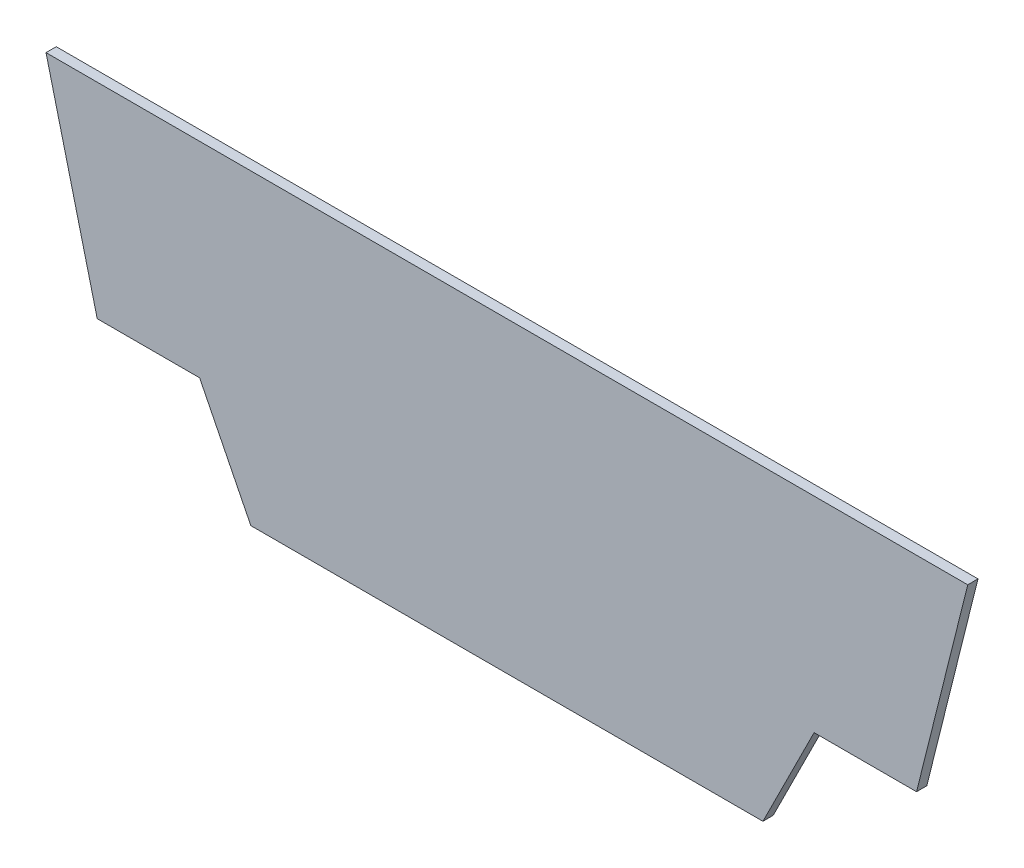
ISO-10303-21;
HEADER;
FILE_DESCRIPTION(('STEP AP214'),'2;1');
FILE_NAME('part.step','',(''),(''),'','','');
FILE_SCHEMA(('AUTOMOTIVE_DESIGN { 1 0 10303 214 1 1 1 1 }'));
ENDSEC;
DATA;
#1=APPLICATION_CONTEXT('core data for automotive mechanical design processes');
#2=APPLICATION_PROTOCOL_DEFINITION('international standard','automotive_design',2000,#1);
#3=PRODUCT_CONTEXT('',#1,'mechanical');
#4=PRODUCT('Part','Part','',(#3));
#5=PRODUCT_RELATED_PRODUCT_CATEGORY('part','',(#4));
#6=PRODUCT_DEFINITION_FORMATION('','',#4);
#7=PRODUCT_DEFINITION_CONTEXT('part definition',#1,'design');
#8=PRODUCT_DEFINITION('design','',#6,#7);
#9=PRODUCT_DEFINITION_SHAPE('','',#8);
#10=(LENGTH_UNIT() NAMED_UNIT(*) SI_UNIT(.MILLI.,.METRE.));
#11=(NAMED_UNIT(*) PLANE_ANGLE_UNIT() SI_UNIT($,.RADIAN.));
#12=(NAMED_UNIT(*) SI_UNIT($,.STERADIAN.) SOLID_ANGLE_UNIT());
#13=UNCERTAINTY_MEASURE_WITH_UNIT(LENGTH_MEASURE(1.E-05),#10,'distance_accuracy_value','');
#14=(GEOMETRIC_REPRESENTATION_CONTEXT(3) GLOBAL_UNCERTAINTY_ASSIGNED_CONTEXT((#13)) GLOBAL_UNIT_ASSIGNED_CONTEXT((#10,
#11,#12)) REPRESENTATION_CONTEXT('',''));
#15=CARTESIAN_POINT('',(0.,0.,0.));
#16=DIRECTION('',(0.,0.,1.));
#17=DIRECTION('',(1.,0.,0.));
#18=AXIS2_PLACEMENT_3D('',#15,#16,#17);
#19=CARTESIAN_POINT('',(80.,20.,2.));
#20=DIRECTION('',(-0.970142500145332,0.242535625036333,0.));
#21=DIRECTION('',(-0.242535625036333,-0.970142500145332,0.));
#22=AXIS2_PLACEMENT_3D('',#19,#20,#21);
#23=PLANE('',#22);
#24=DIRECTION('',(0.242535625036333,0.970142500145332,0.));
#25=VECTOR('',#24,1.);
#26=CARTESIAN_POINT('',(80.,20.,0.));
#27=LINE('',#26,#25);
#28=CARTESIAN_POINT('',(80.,20.,0.));
#29=VERTEX_POINT('',#28);
#30=CARTESIAN_POINT('',(90.,60.,0.));
#31=VERTEX_POINT('',#30);
#32=EDGE_CURVE('E135',#29,#31,#27,.T.);
#33=ORIENTED_EDGE('',*,*,#32,.T.);
#34=DIRECTION('',(0.,0.,-1.));
#35=VECTOR('',#34,1.);
#36=CARTESIAN_POINT('',(90.,60.,2.));
#37=LINE('',#36,#35);
#38=CARTESIAN_POINT('',(90.,60.,2.));
#39=VERTEX_POINT('',#38);
#40=EDGE_CURVE('E11',#39,#31,#37,.T.);
#41=ORIENTED_EDGE('',*,*,#40,.F.);
#42=DIRECTION('',(0.242535625036333,0.970142500145332,0.));
#43=VECTOR('',#42,1.);
#44=CARTESIAN_POINT('',(80.,20.,2.));
#45=LINE('',#44,#43);
#46=CARTESIAN_POINT('',(80.,20.,2.));
#47=VERTEX_POINT('',#46);
#48=EDGE_CURVE('E149',#47,#39,#45,.T.);
#49=ORIENTED_EDGE('',*,*,#48,.F.);
#50=DIRECTION('',(0.,0.,-1.));
#51=VECTOR('',#50,1.);
#52=CARTESIAN_POINT('',(80.,20.,2.));
#53=LINE('',#52,#51);
#54=EDGE_CURVE('E131',#47,#29,#53,.T.);
#55=ORIENTED_EDGE('',*,*,#54,.T.);
#56=EDGE_LOOP('',(#33,#41,#49,#55));
#57=FACE_BOUND('',#56,.T.);
#58=ADVANCED_FACE('F39',(#57),#23,.F.);
#59=CARTESIAN_POINT('',(-90.,60.,2.));
#60=DIRECTION('',(0.,-1.,0.));
#61=DIRECTION('',(0.,0.,-1.));
#62=AXIS2_PLACEMENT_3D('',#59,#60,#61);
#63=PLANE('',#62);
#64=DIRECTION('',(-1.,0.,0.));
#65=VECTOR('',#64,1.);
#66=CARTESIAN_POINT('',(-90.,60.,0.));
#67=LINE('',#66,#65);
#68=CARTESIAN_POINT('',(-90.,60.,0.));
#69=VERTEX_POINT('',#68);
#70=EDGE_CURVE('E138',#31,#69,#67,.T.);
#71=ORIENTED_EDGE('',*,*,#70,.T.);
#72=DIRECTION('',(0.,0.,-1.));
#73=VECTOR('',#72,1.);
#74=CARTESIAN_POINT('',(-90.,60.,2.));
#75=LINE('',#74,#73);
#76=CARTESIAN_POINT('',(-90.,60.,2.));
#77=VERTEX_POINT('',#76);
#78=EDGE_CURVE('E47',#77,#69,#75,.T.);
#79=ORIENTED_EDGE('',*,*,#78,.F.);
#80=DIRECTION('',(-1.,0.,0.));
#81=VECTOR('',#80,1.);
#82=CARTESIAN_POINT('',(-90.,60.,2.));
#83=LINE('',#82,#81);
#84=EDGE_CURVE('E98',#39,#77,#83,.T.);
#85=ORIENTED_EDGE('',*,*,#84,.F.);
#86=ORIENTED_EDGE('',*,*,#40,.T.);
#87=EDGE_LOOP('',(#71,#79,#85,#86));
#88=FACE_BOUND('',#87,.T.);
#89=ADVANCED_FACE('F184',(#88),#63,.F.);
#90=CARTESIAN_POINT('',(-80.,20.,2.));
#91=DIRECTION('',(0.970142500145332,0.242535625036333,0.));
#92=DIRECTION('',(-0.242535625036333,0.970142500145332,0.));
#93=AXIS2_PLACEMENT_3D('',#90,#91,#92);
#94=PLANE('',#93);
#95=DIRECTION('',(0.242535625036333,-0.970142500145332,0.));
#96=VECTOR('',#95,1.);
#97=CARTESIAN_POINT('',(-80.,20.,0.));
#98=LINE('',#97,#96);
#99=CARTESIAN_POINT('',(-80.,20.,0.));
#100=VERTEX_POINT('',#99);
#101=EDGE_CURVE('E140',#69,#100,#98,.T.);
#102=ORIENTED_EDGE('',*,*,#101,.T.);
#103=DIRECTION('',(0.,0.,-1.));
#104=VECTOR('',#103,1.);
#105=CARTESIAN_POINT('',(-80.,20.,2.));
#106=LINE('',#105,#104);
#107=CARTESIAN_POINT('',(-80.,20.,2.));
#108=VERTEX_POINT('',#107);
#109=EDGE_CURVE('E156',#108,#100,#106,.T.);
#110=ORIENTED_EDGE('',*,*,#109,.F.);
#111=DIRECTION('',(0.242535625036333,-0.970142500145332,0.));
#112=VECTOR('',#111,1.);
#113=CARTESIAN_POINT('',(-80.,20.,2.));
#114=LINE('',#113,#112);
#115=EDGE_CURVE('E164',#77,#108,#114,.T.);
#116=ORIENTED_EDGE('',*,*,#115,.F.);
#117=ORIENTED_EDGE('',*,*,#78,.T.);
#118=EDGE_LOOP('',(#102,#110,#116,#117));
#119=FACE_BOUND('',#118,.T.);
#120=ADVANCED_FACE('F162',(#119),#94,.F.);
#121=CARTESIAN_POINT('',(-60.,20.,2.));
#122=DIRECTION('',(0.,1.,0.));
#123=DIRECTION('',(-1.,0.,0.));
#124=AXIS2_PLACEMENT_3D('',#121,#122,#123);
#125=PLANE('',#124);
#126=DIRECTION('',(1.,0.,0.));
#127=VECTOR('',#126,1.);
#128=CARTESIAN_POINT('',(-60.,20.,0.));
#129=LINE('',#128,#127);
#130=CARTESIAN_POINT('',(-60.,20.,0.));
#131=VERTEX_POINT('',#130);
#132=EDGE_CURVE('E142',#100,#131,#129,.T.);
#133=ORIENTED_EDGE('',*,*,#132,.T.);
#134=DIRECTION('',(0.,0.,-1.));
#135=VECTOR('',#134,1.);
#136=CARTESIAN_POINT('',(-60.,20.,2.));
#137=LINE('',#136,#135);
#138=CARTESIAN_POINT('',(-60.,20.,2.));
#139=VERTEX_POINT('',#138);
#140=EDGE_CURVE('E153',#139,#131,#137,.T.);
#141=ORIENTED_EDGE('',*,*,#140,.F.);
#142=DIRECTION('',(1.,0.,0.));
#143=VECTOR('',#142,1.);
#144=CARTESIAN_POINT('',(-60.,20.,2.));
#145=LINE('',#144,#143);
#146=EDGE_CURVE('E176',#108,#139,#145,.T.);
#147=ORIENTED_EDGE('',*,*,#146,.F.);
#148=ORIENTED_EDGE('',*,*,#109,.T.);
#149=EDGE_LOOP('',(#133,#141,#147,#148));
#150=FACE_BOUND('',#149,.T.);
#151=ADVANCED_FACE('F172',(#150),#125,.F.);
#152=CARTESIAN_POINT('',(-50.,0.,2.));
#153=DIRECTION('',(0.894427190999916,0.447213595499958,0.));
#154=DIRECTION('',(-0.447213595499958,0.894427190999916,0.));
#155=AXIS2_PLACEMENT_3D('',#152,#153,#154);
#156=PLANE('',#155);
#157=DIRECTION('',(0.447213595499958,-0.894427190999916,0.));
#158=VECTOR('',#157,1.);
#159=CARTESIAN_POINT('',(-50.,0.,0.));
#160=LINE('',#159,#158);
#161=CARTESIAN_POINT('',(-50.,0.,0.));
#162=VERTEX_POINT('',#161);
#163=EDGE_CURVE('E144',#131,#162,#160,.T.);
#164=ORIENTED_EDGE('',*,*,#163,.T.);
#165=DIRECTION('',(0.,0.,-1.));
#166=VECTOR('',#165,1.);
#167=CARTESIAN_POINT('',(-50.,0.,2.));
#168=LINE('',#167,#166);
#169=CARTESIAN_POINT('',(-50.,0.,2.));
#170=VERTEX_POINT('',#169);
#171=EDGE_CURVE('E126',#170,#162,#168,.T.);
#172=ORIENTED_EDGE('',*,*,#171,.F.);
#173=DIRECTION('',(0.447213595499958,-0.894427190999916,0.));
#174=VECTOR('',#173,1.);
#175=CARTESIAN_POINT('',(-50.,0.,2.));
#176=LINE('',#175,#174);
#177=EDGE_CURVE('E117',#139,#170,#176,.T.);
#178=ORIENTED_EDGE('',*,*,#177,.F.);
#179=ORIENTED_EDGE('',*,*,#140,.T.);
#180=EDGE_LOOP('',(#164,#172,#178,#179));
#181=FACE_BOUND('',#180,.T.);
#182=ADVANCED_FACE('F175',(#181),#156,.F.);
#183=CARTESIAN_POINT('',(50.,0.,2.));
#184=DIRECTION('',(0.,1.,0.));
#185=DIRECTION('',(-1.,0.,0.));
#186=AXIS2_PLACEMENT_3D('',#183,#184,#185);
#187=PLANE('',#186);
#188=DIRECTION('',(1.,0.,0.));
#189=VECTOR('',#188,1.);
#190=CARTESIAN_POINT('',(50.,0.,0.));
#191=LINE('',#190,#189);
#192=CARTESIAN_POINT('',(50.,0.,0.));
#193=VERTEX_POINT('',#192);
#194=EDGE_CURVE('E125',#162,#193,#191,.T.);
#195=ORIENTED_EDGE('',*,*,#194,.T.);
#196=DIRECTION('',(0.,0.,-1.));
#197=VECTOR('',#196,1.);
#198=CARTESIAN_POINT('',(50.,0.,2.));
#199=LINE('',#198,#197);
#200=CARTESIAN_POINT('',(50.,0.,2.));
#201=VERTEX_POINT('',#200);
#202=EDGE_CURVE('E122',#201,#193,#199,.T.);
#203=ORIENTED_EDGE('',*,*,#202,.F.);
#204=DIRECTION('',(1.,0.,0.));
#205=VECTOR('',#204,1.);
#206=CARTESIAN_POINT('',(50.,0.,2.));
#207=LINE('',#206,#205);
#208=EDGE_CURVE('E111',#170,#201,#207,.T.);
#209=ORIENTED_EDGE('',*,*,#208,.F.);
#210=ORIENTED_EDGE('',*,*,#171,.T.);
#211=EDGE_LOOP('',(#195,#203,#209,#210));
#212=FACE_BOUND('',#211,.T.);
#213=ADVANCED_FACE('F123',(#212),#187,.F.);
#214=CARTESIAN_POINT('',(50.,0.,2.));
#215=DIRECTION('',(-0.894427190999916,0.447213595499958,0.));
#216=DIRECTION('',(-0.447213595499958,-0.894427190999916,0.));
#217=AXIS2_PLACEMENT_3D('',#214,#215,#216);
#218=PLANE('',#217);
#219=DIRECTION('',(0.447213595499958,0.894427190999916,0.));
#220=VECTOR('',#219,1.);
#221=CARTESIAN_POINT('',(50.,0.,0.));
#222=LINE('',#221,#220);
#223=CARTESIAN_POINT('',(60.,20.,0.));
#224=VERTEX_POINT('',#223);
#225=EDGE_CURVE('E84',#193,#224,#222,.T.);
#226=ORIENTED_EDGE('',*,*,#225,.T.);
#227=DIRECTION('',(0.,0.,-1.));
#228=VECTOR('',#227,1.);
#229=CARTESIAN_POINT('',(60.,20.,2.));
#230=LINE('',#229,#228);
#231=CARTESIAN_POINT('',(60.,20.,2.));
#232=VERTEX_POINT('',#231);
#233=EDGE_CURVE('E127',#232,#224,#230,.T.);
#234=ORIENTED_EDGE('',*,*,#233,.F.);
#235=DIRECTION('',(0.447213595499958,0.894427190999916,0.));
#236=VECTOR('',#235,1.);
#237=CARTESIAN_POINT('',(50.,0.,2.));
#238=LINE('',#237,#236);
#239=EDGE_CURVE('E115',#201,#232,#238,.T.);
#240=ORIENTED_EDGE('',*,*,#239,.F.);
#241=ORIENTED_EDGE('',*,*,#202,.T.);
#242=EDGE_LOOP('',(#226,#234,#240,#241));
#243=FACE_BOUND('',#242,.T.);
#244=ADVANCED_FACE('F129',(#243),#218,.F.);
#245=CARTESIAN_POINT('',(60.,20.,2.));
#246=DIRECTION('',(0.,1.,0.));
#247=DIRECTION('',(-1.,0.,0.));
#248=AXIS2_PLACEMENT_3D('',#245,#246,#247);
#249=PLANE('',#248);
#250=DIRECTION('',(1.,0.,0.));
#251=VECTOR('',#250,1.);
#252=CARTESIAN_POINT('',(60.,20.,0.));
#253=LINE('',#252,#251);
#254=EDGE_CURVE('E90',#224,#29,#253,.T.);
#255=ORIENTED_EDGE('',*,*,#254,.T.);
#256=ORIENTED_EDGE('',*,*,#54,.F.);
#257=DIRECTION('',(1.,0.,0.));
#258=VECTOR('',#257,1.);
#259=CARTESIAN_POINT('',(60.,20.,2.));
#260=LINE('',#259,#258);
#261=EDGE_CURVE('E55',#232,#47,#260,.T.);
#262=ORIENTED_EDGE('',*,*,#261,.F.);
#263=ORIENTED_EDGE('',*,*,#233,.T.);
#264=EDGE_LOOP('',(#255,#256,#262,#263));
#265=FACE_BOUND('',#264,.T.);
#266=ADVANCED_FACE('F200',(#265),#249,.F.);
#267=CARTESIAN_POINT('',(0.,0.,2.));
#268=DIRECTION('',(0.,0.,-1.));
#269=DIRECTION('',(-1.,0.,0.));
#270=AXIS2_PLACEMENT_3D('',#267,#268,#269);
#271=PLANE('',#270);
#272=ORIENTED_EDGE('',*,*,#48,.T.);
#273=ORIENTED_EDGE('',*,*,#84,.T.);
#274=ORIENTED_EDGE('',*,*,#115,.T.);
#275=ORIENTED_EDGE('',*,*,#146,.T.);
#276=ORIENTED_EDGE('',*,*,#177,.T.);
#277=ORIENTED_EDGE('',*,*,#208,.T.);
#278=ORIENTED_EDGE('',*,*,#239,.T.);
#279=ORIENTED_EDGE('',*,*,#261,.T.);
#280=EDGE_LOOP('',(#272,#273,#274,#275,#276,#277,#278,#279));
#281=FACE_BOUND('',#280,.T.);
#282=ADVANCED_FACE('F113',(#281),#271,.F.);
#283=CARTESIAN_POINT('',(0.,0.,0.));
#284=DIRECTION('',(0.,0.,-1.));
#285=DIRECTION('',(-1.,0.,0.));
#286=AXIS2_PLACEMENT_3D('',#283,#284,#285);
#287=PLANE('',#286);
#288=ORIENTED_EDGE('',*,*,#32,.F.);
#289=ORIENTED_EDGE('',*,*,#254,.F.);
#290=ORIENTED_EDGE('',*,*,#225,.F.);
#291=ORIENTED_EDGE('',*,*,#194,.F.);
#292=ORIENTED_EDGE('',*,*,#163,.F.);
#293=ORIENTED_EDGE('',*,*,#132,.F.);
#294=ORIENTED_EDGE('',*,*,#101,.F.);
#295=ORIENTED_EDGE('',*,*,#70,.F.);
#296=EDGE_LOOP('',(#288,#289,#290,#291,#292,#293,#294,#295));
#297=FACE_BOUND('',#296,.T.);
#298=ADVANCED_FACE('F168',(#297),#287,.T.);
#299=CLOSED_SHELL('',(#58,#89,#120,#151,#182,#213,#244,#266,#282,#298));
#300=MANIFOLD_SOLID_BREP('B2',#299);
#301=ADVANCED_BREP_SHAPE_REPRESENTATION('',(#18,#300),#14);
#302=SHAPE_DEFINITION_REPRESENTATION(#9,#301);
ENDSEC;
END-ISO-10303-21;
